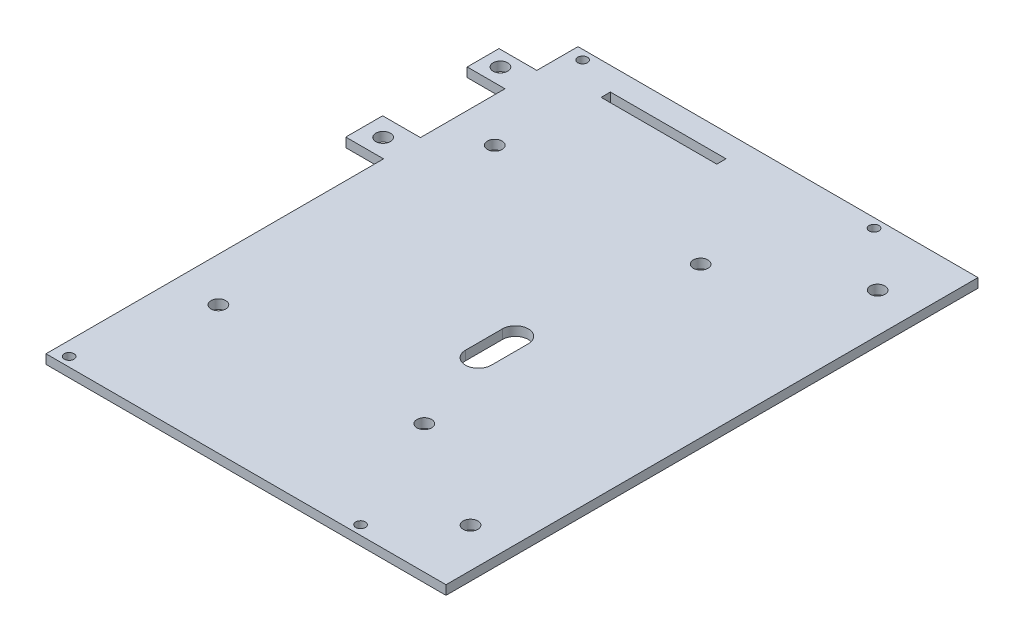
ISO-10303-21;
HEADER;
FILE_DESCRIPTION(('STEP AP214'),'2;1');
FILE_NAME('part.step','',(''),(''),'','','');
FILE_SCHEMA(('AUTOMOTIVE_DESIGN { 1 0 10303 214 1 1 1 1 }'));
ENDSEC;
DATA;
#1=APPLICATION_CONTEXT('core data for automotive mechanical design processes');
#2=APPLICATION_PROTOCOL_DEFINITION('international standard','automotive_design',2000,#1);
#3=PRODUCT_CONTEXT('',#1,'mechanical');
#4=PRODUCT('Part','Part','',(#3));
#5=PRODUCT_RELATED_PRODUCT_CATEGORY('part','',(#4));
#6=PRODUCT_DEFINITION_FORMATION('','',#4);
#7=PRODUCT_DEFINITION_CONTEXT('part definition',#1,'design');
#8=PRODUCT_DEFINITION('design','',#6,#7);
#9=PRODUCT_DEFINITION_SHAPE('','',#8);
#10=(LENGTH_UNIT() NAMED_UNIT(*) SI_UNIT(.MILLI.,.METRE.));
#11=(NAMED_UNIT(*) PLANE_ANGLE_UNIT() SI_UNIT($,.RADIAN.));
#12=(NAMED_UNIT(*) SI_UNIT($,.STERADIAN.) SOLID_ANGLE_UNIT());
#13=UNCERTAINTY_MEASURE_WITH_UNIT(LENGTH_MEASURE(1.E-05),#10,'distance_accuracy_value','');
#14=(GEOMETRIC_REPRESENTATION_CONTEXT(3) GLOBAL_UNCERTAINTY_ASSIGNED_CONTEXT((#13)) GLOBAL_UNIT_ASSIGNED_CONTEXT((#10,
#11,#12)) REPRESENTATION_CONTEXT('',''));
#15=CARTESIAN_POINT('',(0.,0.,0.));
#16=DIRECTION('',(0.,0.,1.));
#17=DIRECTION('',(1.,0.,0.));
#18=AXIS2_PLACEMENT_3D('',#15,#16,#17);
#19=CARTESIAN_POINT('',(0.,2.,5.));
#20=DIRECTION('',(0.,0.,-1.));
#21=DIRECTION('',(-1.,0.,0.));
#22=AXIS2_PLACEMENT_3D('',#19,#20,#21);
#23=PLANE('',#22);
#24=DIRECTION('',(1.,0.,0.));
#25=VECTOR('',#24,1.);
#26=CARTESIAN_POINT('',(0.,0.,5.));
#27=LINE('',#26,#25);
#28=CARTESIAN_POINT('',(12.,0.,5.));
#29=VERTEX_POINT('',#28);
#30=CARTESIAN_POINT('',(37.,0.,5.));
#31=VERTEX_POINT('',#30);
#32=EDGE_CURVE('E321',#29,#31,#27,.T.);
#33=ORIENTED_EDGE('',*,*,#32,.T.);
#34=DIRECTION('',(0.,-1.,0.));
#35=VECTOR('',#34,1.);
#36=CARTESIAN_POINT('',(37.,2.,5.));
#37=LINE('',#36,#35);
#38=CARTESIAN_POINT('',(37.,2.,5.));
#39=VERTEX_POINT('',#38);
#40=EDGE_CURVE('E11',#39,#31,#37,.T.);
#41=ORIENTED_EDGE('',*,*,#40,.F.);
#42=DIRECTION('',(1.,0.,0.));
#43=VECTOR('',#42,1.);
#44=CARTESIAN_POINT('',(0.,2.,5.));
#45=LINE('',#44,#43);
#46=CARTESIAN_POINT('',(12.,2.,5.));
#47=VERTEX_POINT('',#46);
#48=EDGE_CURVE('E194',#47,#39,#45,.T.);
#49=ORIENTED_EDGE('',*,*,#48,.F.);
#50=DIRECTION('',(0.,-1.,0.));
#51=VECTOR('',#50,1.);
#52=CARTESIAN_POINT('',(12.,2.,5.));
#53=LINE('',#52,#51);
#54=EDGE_CURVE('E61',#47,#29,#53,.T.);
#55=ORIENTED_EDGE('',*,*,#54,.T.);
#56=EDGE_LOOP('',(#33,#41,#49,#55));
#57=FACE_BOUND('',#56,.T.);
#58=ADVANCED_FACE('F41',(#57),#23,.F.);
#59=CARTESIAN_POINT('',(37.,2.,0.));
#60=DIRECTION('',(1.,0.,0.));
#61=DIRECTION('',(0.,0.,-1.));
#62=AXIS2_PLACEMENT_3D('',#59,#60,#61);
#63=PLANE('',#62);
#64=DIRECTION('',(0.,0.,1.));
#65=VECTOR('',#64,1.);
#66=CARTESIAN_POINT('',(37.,0.,0.));
#67=LINE('',#66,#65);
#68=CARTESIAN_POINT('',(37.,0.,7.));
#69=VERTEX_POINT('',#68);
#70=EDGE_CURVE('E201',#31,#69,#67,.T.);
#71=ORIENTED_EDGE('',*,*,#70,.T.);
#72=DIRECTION('',(0.,-1.,0.));
#73=VECTOR('',#72,1.);
#74=CARTESIAN_POINT('',(37.,2.,7.));
#75=LINE('',#74,#73);
#76=CARTESIAN_POINT('',(37.,2.,7.));
#77=VERTEX_POINT('',#76);
#78=EDGE_CURVE('E52',#77,#69,#75,.T.);
#79=ORIENTED_EDGE('',*,*,#78,.F.);
#80=DIRECTION('',(0.,0.,1.));
#81=VECTOR('',#80,1.);
#82=CARTESIAN_POINT('',(37.,2.,0.));
#83=LINE('',#82,#81);
#84=EDGE_CURVE('E187',#39,#77,#83,.T.);
#85=ORIENTED_EDGE('',*,*,#84,.F.);
#86=ORIENTED_EDGE('',*,*,#40,.T.);
#87=EDGE_LOOP('',(#71,#79,#85,#86));
#88=FACE_BOUND('',#87,.T.);
#89=ADVANCED_FACE('F200',(#88),#63,.F.);
#90=CARTESIAN_POINT('',(0.,2.,7.));
#91=DIRECTION('',(0.,0.,-1.));
#92=DIRECTION('',(-1.,0.,0.));
#93=AXIS2_PLACEMENT_3D('',#90,#91,#92);
#94=PLANE('',#93);
#95=DIRECTION('',(1.,0.,0.));
#96=VECTOR('',#95,1.);
#97=CARTESIAN_POINT('',(0.,0.,7.));
#98=LINE('',#97,#96);
#99=CARTESIAN_POINT('',(12.,0.,7.));
#100=VERTEX_POINT('',#99);
#101=EDGE_CURVE('E326',#100,#69,#98,.T.);
#102=ORIENTED_EDGE('',*,*,#101,.F.);
#103=DIRECTION('',(0.,-1.,0.));
#104=VECTOR('',#103,1.);
#105=CARTESIAN_POINT('',(12.,2.,7.));
#106=LINE('',#105,#104);
#107=CARTESIAN_POINT('',(12.,2.,7.));
#108=VERTEX_POINT('',#107);
#109=EDGE_CURVE('E123',#108,#100,#106,.T.);
#110=ORIENTED_EDGE('',*,*,#109,.F.);
#111=DIRECTION('',(1.,0.,0.));
#112=VECTOR('',#111,1.);
#113=CARTESIAN_POINT('',(0.,2.,7.));
#114=LINE('',#113,#112);
#115=EDGE_CURVE('E193',#108,#77,#114,.T.);
#116=ORIENTED_EDGE('',*,*,#115,.T.);
#117=ORIENTED_EDGE('',*,*,#78,.T.);
#118=EDGE_LOOP('',(#102,#110,#116,#117));
#119=FACE_BOUND('',#118,.T.);
#120=ADVANCED_FACE('F206',(#119),#94,.T.);
#121=CARTESIAN_POINT('',(86.47,2.,0.));
#122=DIRECTION('',(1.,0.,0.));
#123=DIRECTION('',(0.,0.,-1.));
#124=AXIS2_PLACEMENT_3D('',#121,#122,#123);
#125=PLANE('',#124);
#126=DIRECTION('',(0.,0.,1.));
#127=VECTOR('',#126,1.);
#128=CARTESIAN_POINT('',(86.47,0.,0.));
#129=LINE('',#128,#127);
#130=CARTESIAN_POINT('',(86.47,0.,0.));
#131=VERTEX_POINT('',#130);
#132=CARTESIAN_POINT('',(86.47,0.,115.));
#133=VERTEX_POINT('',#132);
#134=EDGE_CURVE('E279',#131,#133,#129,.T.);
#135=ORIENTED_EDGE('',*,*,#134,.F.);
#136=DIRECTION('',(0.,-1.,0.));
#137=VECTOR('',#136,1.);
#138=CARTESIAN_POINT('',(86.47,2.,0.));
#139=LINE('',#138,#137);
#140=CARTESIAN_POINT('',(86.47,2.,0.));
#141=VERTEX_POINT('',#140);
#142=EDGE_CURVE('E344',#141,#131,#139,.T.);
#143=ORIENTED_EDGE('',*,*,#142,.F.);
#144=DIRECTION('',(0.,0.,1.));
#145=VECTOR('',#144,1.);
#146=CARTESIAN_POINT('',(86.47,2.,0.));
#147=LINE('',#146,#145);
#148=CARTESIAN_POINT('',(86.47,2.,115.));
#149=VERTEX_POINT('',#148);
#150=EDGE_CURVE('E465',#141,#149,#147,.T.);
#151=ORIENTED_EDGE('',*,*,#150,.T.);
#152=DIRECTION('',(0.,-1.,0.));
#153=VECTOR('',#152,1.);
#154=CARTESIAN_POINT('',(86.47,2.,115.));
#155=LINE('',#154,#153);
#156=EDGE_CURVE('E347',#149,#133,#155,.T.);
#157=ORIENTED_EDGE('',*,*,#156,.T.);
#158=EDGE_LOOP('',(#135,#143,#151,#157));
#159=FACE_BOUND('',#158,.T.);
#160=ADVANCED_FACE('F561',(#159),#125,.T.);
#161=CARTESIAN_POINT('',(0.,2.,0.));
#162=DIRECTION('',(0.,0.,-1.));
#163=DIRECTION('',(-1.,0.,0.));
#164=AXIS2_PLACEMENT_3D('',#161,#162,#163);
#165=PLANE('',#164);
#166=DIRECTION('',(1.,0.,0.));
#167=VECTOR('',#166,1.);
#168=CARTESIAN_POINT('',(0.,0.,0.));
#169=LINE('',#168,#167);
#170=CARTESIAN_POINT('',(0.,0.,0.));
#171=VERTEX_POINT('',#170);
#172=EDGE_CURVE('E283',#171,#131,#169,.T.);
#173=ORIENTED_EDGE('',*,*,#172,.F.);
#174=DIRECTION('',(0.,-1.,0.));
#175=VECTOR('',#174,1.);
#176=CARTESIAN_POINT('',(0.,2.,0.));
#177=LINE('',#176,#175);
#178=CARTESIAN_POINT('',(0.,2.,0.));
#179=VERTEX_POINT('',#178);
#180=EDGE_CURVE('E382',#179,#171,#177,.T.);
#181=ORIENTED_EDGE('',*,*,#180,.F.);
#182=DIRECTION('',(1.,0.,0.));
#183=VECTOR('',#182,1.);
#184=CARTESIAN_POINT('',(0.,2.,0.));
#185=LINE('',#184,#183);
#186=EDGE_CURVE('E469',#179,#141,#185,.T.);
#187=ORIENTED_EDGE('',*,*,#186,.T.);
#188=ORIENTED_EDGE('',*,*,#142,.T.);
#189=EDGE_LOOP('',(#173,#181,#187,#188));
#190=FACE_BOUND('',#189,.T.);
#191=ADVANCED_FACE('F538',(#190),#165,.T.);
#192=CARTESIAN_POINT('',(0.,2.,0.));
#193=DIRECTION('',(1.,0.,0.));
#194=DIRECTION('',(0.,0.,-1.));
#195=AXIS2_PLACEMENT_3D('',#192,#193,#194);
#196=PLANE('',#195);
#197=DIRECTION('',(0.,0.,1.));
#198=VECTOR('',#197,1.);
#199=CARTESIAN_POINT('',(0.,0.,0.));
#200=LINE('',#199,#198);
#201=CARTESIAN_POINT('',(0.,0.,8.90000000000004));
#202=VERTEX_POINT('',#201);
#203=EDGE_CURVE('E287',#171,#202,#200,.T.);
#204=ORIENTED_EDGE('',*,*,#203,.T.);
#205=DIRECTION('',(0.,-1.,0.));
#206=VECTOR('',#205,1.);
#207=CARTESIAN_POINT('',(0.,2.,8.90000000000004));
#208=LINE('',#207,#206);
#209=CARTESIAN_POINT('',(0.,2.,8.90000000000004));
#210=VERTEX_POINT('',#209);
#211=EDGE_CURVE('E379',#210,#202,#208,.T.);
#212=ORIENTED_EDGE('',*,*,#211,.F.);
#213=DIRECTION('',(0.,0.,1.));
#214=VECTOR('',#213,1.);
#215=CARTESIAN_POINT('',(0.,2.,0.));
#216=LINE('',#215,#214);
#217=EDGE_CURVE('E473',#179,#210,#216,.T.);
#218=ORIENTED_EDGE('',*,*,#217,.F.);
#219=ORIENTED_EDGE('',*,*,#180,.T.);
#220=EDGE_LOOP('',(#204,#212,#218,#219));
#221=FACE_BOUND('',#220,.T.);
#222=ADVANCED_FACE('F544',(#221),#196,.F.);
#223=CARTESIAN_POINT('',(0.,2.,8.90000000000003));
#224=DIRECTION('',(0.,0.,-1.));
#225=DIRECTION('',(-1.,0.,0.));
#226=AXIS2_PLACEMENT_3D('',#223,#224,#225);
#227=PLANE('',#226);
#228=DIRECTION('',(1.,0.,0.));
#229=VECTOR('',#228,1.);
#230=CARTESIAN_POINT('',(0.,0.,8.90000000000003));
#231=LINE('',#230,#229);
#232=CARTESIAN_POINT('',(-8.17000000000001,0.,8.90000000000005));
#233=VERTEX_POINT('',#232);
#234=EDGE_CURVE('E291',#233,#202,#231,.T.);
#235=ORIENTED_EDGE('',*,*,#234,.F.);
#236=DIRECTION('',(0.,-1.,0.));
#237=VECTOR('',#236,1.);
#238=CARTESIAN_POINT('',(-8.17000000000001,2.,8.90000000000005));
#239=LINE('',#238,#237);
#240=CARTESIAN_POINT('',(-8.17000000000001,2.,8.90000000000005));
#241=VERTEX_POINT('',#240);
#242=EDGE_CURVE('E376',#241,#233,#239,.T.);
#243=ORIENTED_EDGE('',*,*,#242,.F.);
#244=DIRECTION('',(1.,0.,0.));
#245=VECTOR('',#244,1.);
#246=CARTESIAN_POINT('',(0.,2.,8.90000000000003));
#247=LINE('',#246,#245);
#248=EDGE_CURVE('E476',#241,#210,#247,.T.);
#249=ORIENTED_EDGE('',*,*,#248,.T.);
#250=ORIENTED_EDGE('',*,*,#211,.T.);
#251=EDGE_LOOP('',(#235,#243,#249,#250));
#252=FACE_BOUND('',#251,.T.);
#253=ADVANCED_FACE('F550',(#252),#227,.T.);
#254=CARTESIAN_POINT('',(-8.17000000000001,2.,0.));
#255=DIRECTION('',(1.,0.,0.));
#256=DIRECTION('',(0.,0.,-1.));
#257=AXIS2_PLACEMENT_3D('',#254,#255,#256);
#258=PLANE('',#257);
#259=DIRECTION('',(0.,0.,1.));
#260=VECTOR('',#259,1.);
#261=CARTESIAN_POINT('',(-8.17000000000001,0.,0.));
#262=LINE('',#261,#260);
#263=CARTESIAN_POINT('',(-8.17000000000001,0.,15.78));
#264=VERTEX_POINT('',#263);
#265=EDGE_CURVE('E297',#233,#264,#262,.T.);
#266=ORIENTED_EDGE('',*,*,#265,.T.);
#267=DIRECTION('',(0.,-1.,0.));
#268=VECTOR('',#267,1.);
#269=CARTESIAN_POINT('',(-8.17000000000001,2.,15.78));
#270=LINE('',#269,#268);
#271=CARTESIAN_POINT('',(-8.17000000000001,2.,15.78));
#272=VERTEX_POINT('',#271);
#273=EDGE_CURVE('E372',#272,#264,#270,.T.);
#274=ORIENTED_EDGE('',*,*,#273,.F.);
#275=DIRECTION('',(0.,0.,1.));
#276=VECTOR('',#275,1.);
#277=CARTESIAN_POINT('',(-8.17000000000001,2.,0.));
#278=LINE('',#277,#276);
#279=EDGE_CURVE('E482',#241,#272,#278,.T.);
#280=ORIENTED_EDGE('',*,*,#279,.F.);
#281=ORIENTED_EDGE('',*,*,#242,.T.);
#282=EDGE_LOOP('',(#266,#274,#280,#281));
#283=FACE_BOUND('',#282,.T.);
#284=ADVANCED_FACE('F553',(#283),#258,.F.);
#285=CARTESIAN_POINT('',(0.,2.,15.78));
#286=DIRECTION('',(0.,0.,-1.));
#287=DIRECTION('',(-1.,0.,0.));
#288=AXIS2_PLACEMENT_3D('',#285,#286,#287);
#289=PLANE('',#288);
#290=DIRECTION('',(1.,0.,0.));
#291=VECTOR('',#290,1.);
#292=CARTESIAN_POINT('',(0.,0.,15.78));
#293=LINE('',#292,#291);
#294=CARTESIAN_POINT('',(0.,0.,15.78));
#295=VERTEX_POINT('',#294);
#296=EDGE_CURVE('E301',#264,#295,#293,.T.);
#297=ORIENTED_EDGE('',*,*,#296,.T.);
#298=DIRECTION('',(0.,-1.,0.));
#299=VECTOR('',#298,1.);
#300=CARTESIAN_POINT('',(0.,2.,15.78));
#301=LINE('',#300,#299);
#302=CARTESIAN_POINT('',(0.,2.,15.78));
#303=VERTEX_POINT('',#302);
#304=EDGE_CURVE('E368',#303,#295,#301,.T.);
#305=ORIENTED_EDGE('',*,*,#304,.F.);
#306=DIRECTION('',(1.,0.,0.));
#307=VECTOR('',#306,1.);
#308=CARTESIAN_POINT('',(0.,2.,15.78));
#309=LINE('',#308,#307);
#310=EDGE_CURVE('E486',#272,#303,#309,.T.);
#311=ORIENTED_EDGE('',*,*,#310,.F.);
#312=ORIENTED_EDGE('',*,*,#273,.T.);
#313=EDGE_LOOP('',(#297,#305,#311,#312));
#314=FACE_BOUND('',#313,.T.);
#315=ADVANCED_FACE('F555',(#314),#289,.F.);
#316=CARTESIAN_POINT('',(0.,0.,34.06));
#317=VERTEX_POINT('',#316);
#318=EDGE_CURVE('E293',#295,#317,#200,.T.);
#319=ORIENTED_EDGE('',*,*,#318,.T.);
#320=DIRECTION('',(0.,-1.,0.));
#321=VECTOR('',#320,1.);
#322=CARTESIAN_POINT('',(0.,2.,34.06));
#323=LINE('',#322,#321);
#324=CARTESIAN_POINT('',(0.,2.,34.06));
#325=VERTEX_POINT('',#324);
#326=EDGE_CURVE('E365',#325,#317,#323,.T.);
#327=ORIENTED_EDGE('',*,*,#326,.F.);
#328=EDGE_CURVE('E478',#303,#325,#216,.T.);
#329=ORIENTED_EDGE('',*,*,#328,.F.);
#330=ORIENTED_EDGE('',*,*,#304,.T.);
#331=EDGE_LOOP('',(#319,#327,#329,#330));
#332=FACE_BOUND('',#331,.T.);
#333=ADVANCED_FACE('F515',(#332),#196,.F.);
#334=CARTESIAN_POINT('',(0.,2.,34.06));
#335=DIRECTION('',(0.,0.,-1.));
#336=DIRECTION('',(-1.,0.,0.));
#337=AXIS2_PLACEMENT_3D('',#334,#335,#336);
#338=PLANE('',#337);
#339=DIRECTION('',(1.,0.,0.));
#340=VECTOR('',#339,1.);
#341=CARTESIAN_POINT('',(0.,0.,34.06));
#342=LINE('',#341,#340);
#343=CARTESIAN_POINT('',(-8.17000000000001,0.,34.06));
#344=VERTEX_POINT('',#343);
#345=EDGE_CURVE('E305',#344,#317,#342,.T.);
#346=ORIENTED_EDGE('',*,*,#345,.F.);
#347=DIRECTION('',(0.,-1.,0.));
#348=VECTOR('',#347,1.);
#349=CARTESIAN_POINT('',(-8.17000000000001,2.,34.06));
#350=LINE('',#349,#348);
#351=CARTESIAN_POINT('',(-8.17000000000001,2.,34.06));
#352=VERTEX_POINT('',#351);
#353=EDGE_CURVE('E362',#352,#344,#350,.T.);
#354=ORIENTED_EDGE('',*,*,#353,.F.);
#355=DIRECTION('',(1.,0.,0.));
#356=VECTOR('',#355,1.);
#357=CARTESIAN_POINT('',(0.,2.,34.06));
#358=LINE('',#357,#356);
#359=EDGE_CURVE('E490',#352,#325,#358,.T.);
#360=ORIENTED_EDGE('',*,*,#359,.T.);
#361=ORIENTED_EDGE('',*,*,#326,.T.);
#362=EDGE_LOOP('',(#346,#354,#360,#361));
#363=FACE_BOUND('',#362,.T.);
#364=ADVANCED_FACE('F518',(#363),#338,.T.);
#365=CARTESIAN_POINT('',(-8.17000000000001,2.,0.));
#366=DIRECTION('',(1.,0.,0.));
#367=DIRECTION('',(0.,0.,-1.));
#368=AXIS2_PLACEMENT_3D('',#365,#366,#367);
#369=PLANE('',#368);
#370=DIRECTION('',(0.,0.,1.));
#371=VECTOR('',#370,1.);
#372=CARTESIAN_POINT('',(-8.17000000000001,0.,0.));
#373=LINE('',#372,#371);
#374=CARTESIAN_POINT('',(-8.17000000000001,0.,42.03));
#375=VERTEX_POINT('',#374);
#376=EDGE_CURVE('E309',#344,#375,#373,.T.);
#377=ORIENTED_EDGE('',*,*,#376,.T.);
#378=DIRECTION('',(0.,-1.,0.));
#379=VECTOR('',#378,1.);
#380=CARTESIAN_POINT('',(-8.17000000000001,2.,42.03));
#381=LINE('',#380,#379);
#382=CARTESIAN_POINT('',(-8.17000000000001,2.,42.03));
#383=VERTEX_POINT('',#382);
#384=EDGE_CURVE('E358',#383,#375,#381,.T.);
#385=ORIENTED_EDGE('',*,*,#384,.F.);
#386=DIRECTION('',(0.,0.,1.));
#387=VECTOR('',#386,1.);
#388=CARTESIAN_POINT('',(-8.17000000000001,2.,0.));
#389=LINE('',#388,#387);
#390=EDGE_CURVE('E494',#352,#383,#389,.T.);
#391=ORIENTED_EDGE('',*,*,#390,.F.);
#392=ORIENTED_EDGE('',*,*,#353,.T.);
#393=EDGE_LOOP('',(#377,#385,#391,#392));
#394=FACE_BOUND('',#393,.T.);
#395=ADVANCED_FACE('F523',(#394),#369,.F.);
#396=CARTESIAN_POINT('',(0.,2.,42.03));
#397=DIRECTION('',(0.,0.,-1.));
#398=DIRECTION('',(-1.,0.,0.));
#399=AXIS2_PLACEMENT_3D('',#396,#397,#398);
#400=PLANE('',#399);
#401=DIRECTION('',(1.,0.,0.));
#402=VECTOR('',#401,1.);
#403=CARTESIAN_POINT('',(0.,0.,42.03));
#404=LINE('',#403,#402);
#405=CARTESIAN_POINT('',(0.,0.,42.03));
#406=VERTEX_POINT('',#405);
#407=EDGE_CURVE('E313',#375,#406,#404,.T.);
#408=ORIENTED_EDGE('',*,*,#407,.T.);
#409=DIRECTION('',(0.,-1.,0.));
#410=VECTOR('',#409,1.);
#411=CARTESIAN_POINT('',(0.,2.,42.03));
#412=LINE('',#411,#410);
#413=CARTESIAN_POINT('',(0.,2.,42.03));
#414=VERTEX_POINT('',#413);
#415=EDGE_CURVE('E354',#414,#406,#412,.T.);
#416=ORIENTED_EDGE('',*,*,#415,.F.);
#417=DIRECTION('',(1.,0.,0.));
#418=VECTOR('',#417,1.);
#419=CARTESIAN_POINT('',(0.,2.,42.03));
#420=LINE('',#419,#418);
#421=EDGE_CURVE('E498',#383,#414,#420,.T.);
#422=ORIENTED_EDGE('',*,*,#421,.F.);
#423=ORIENTED_EDGE('',*,*,#384,.T.);
#424=EDGE_LOOP('',(#408,#416,#422,#423));
#425=FACE_BOUND('',#424,.T.);
#426=ADVANCED_FACE('F527',(#425),#400,.F.);
#427=CARTESIAN_POINT('',(0.,0.,115.));
#428=VERTEX_POINT('',#427);
#429=EDGE_CURVE('E292',#406,#428,#200,.T.);
#430=ORIENTED_EDGE('',*,*,#429,.T.);
#431=DIRECTION('',(0.,-1.,0.));
#432=VECTOR('',#431,1.);
#433=CARTESIAN_POINT('',(0.,2.,115.));
#434=LINE('',#433,#432);
#435=CARTESIAN_POINT('',(0.,2.,115.));
#436=VERTEX_POINT('',#435);
#437=EDGE_CURVE('E350',#436,#428,#434,.T.);
#438=ORIENTED_EDGE('',*,*,#437,.F.);
#439=EDGE_CURVE('E477',#414,#436,#216,.T.);
#440=ORIENTED_EDGE('',*,*,#439,.F.);
#441=ORIENTED_EDGE('',*,*,#415,.T.);
#442=EDGE_LOOP('',(#430,#438,#440,#441));
#443=FACE_BOUND('',#442,.T.);
#444=ADVANCED_FACE('F530',(#443),#196,.F.);
#445=CARTESIAN_POINT('',(47.47,2.,69.));
#446=DIRECTION('',(0.,-1.,0.));
#447=DIRECTION('',(0.,0.,-1.));
#448=AXIS2_PLACEMENT_3D('',#445,#446,#447);
#449=CYLINDRICAL_SURFACE('',#448,2.8);
#450=CARTESIAN_POINT('',(47.47,0.,69.));
#451=DIRECTION('',(0.,1.,0.));
#452=DIRECTION('',(0.,0.,1.));
#453=AXIS2_PLACEMENT_3D('',#450,#451,#452);
#454=CIRCLE('',#453,2.8);
#455=CARTESIAN_POINT('',(44.67,0.,69.));
#456=VERTEX_POINT('',#455);
#457=CARTESIAN_POINT('',(50.27,0.,69.));
#458=VERTEX_POINT('',#457);
#459=EDGE_CURVE('E223',#456,#458,#454,.T.);
#460=ORIENTED_EDGE('',*,*,#459,.F.);
#461=DIRECTION('',(0.,-1.,0.));
#462=VECTOR('',#461,1.);
#463=CARTESIAN_POINT('',(44.67,2.,69.));
#464=LINE('',#463,#462);
#465=CARTESIAN_POINT('',(44.67,2.,69.));
#466=VERTEX_POINT('',#465);
#467=EDGE_CURVE('E45',#466,#456,#464,.T.);
#468=ORIENTED_EDGE('',*,*,#467,.F.);
#469=CARTESIAN_POINT('',(47.47,2.,69.));
#470=DIRECTION('',(0.,1.,0.));
#471=DIRECTION('',(0.,0.,1.));
#472=AXIS2_PLACEMENT_3D('',#469,#470,#471);
#473=CIRCLE('',#472,2.8);
#474=CARTESIAN_POINT('',(50.27,2.,69.));
#475=VERTEX_POINT('',#474);
#476=EDGE_CURVE('E341',#466,#475,#473,.T.);
#477=ORIENTED_EDGE('',*,*,#476,.T.);
#478=DIRECTION('',(0.,-1.,0.));
#479=VECTOR('',#478,1.);
#480=CARTESIAN_POINT('',(50.27,2.,69.));
#481=LINE('',#480,#479);
#482=EDGE_CURVE('E222',#475,#458,#481,.T.);
#483=ORIENTED_EDGE('',*,*,#482,.T.);
#484=EDGE_LOOP('',(#460,#468,#477,#483));
#485=FACE_BOUND('',#484,.T.);
#486=ADVANCED_FACE('F43',(#485),#449,.F.);
#487=CARTESIAN_POINT('',(44.67,2.,0.));
#488=DIRECTION('',(1.,0.,0.));
#489=DIRECTION('',(0.,0.,-1.));
#490=AXIS2_PLACEMENT_3D('',#487,#488,#489);
#491=PLANE('',#490);
#492=DIRECTION('',(0.,0.,1.));
#493=VECTOR('',#492,1.);
#494=CARTESIAN_POINT('',(44.67,0.,0.));
#495=LINE('',#494,#493);
#496=CARTESIAN_POINT('',(44.67,0.,61.));
#497=VERTEX_POINT('',#496);
#498=EDGE_CURVE('E227',#497,#456,#495,.T.);
#499=ORIENTED_EDGE('',*,*,#498,.F.);
#500=DIRECTION('',(0.,-1.,0.));
#501=VECTOR('',#500,1.);
#502=CARTESIAN_POINT('',(44.67,2.,61.));
#503=LINE('',#502,#501);
#504=CARTESIAN_POINT('',(44.67,2.,61.));
#505=VERTEX_POINT('',#504);
#506=EDGE_CURVE('E391',#505,#497,#503,.T.);
#507=ORIENTED_EDGE('',*,*,#506,.F.);
#508=DIRECTION('',(0.,0.,1.));
#509=VECTOR('',#508,1.);
#510=CARTESIAN_POINT('',(44.67,2.,0.));
#511=LINE('',#510,#509);
#512=EDGE_CURVE('E402',#505,#466,#511,.T.);
#513=ORIENTED_EDGE('',*,*,#512,.T.);
#514=ORIENTED_EDGE('',*,*,#467,.T.);
#515=EDGE_LOOP('',(#499,#507,#513,#514));
#516=FACE_BOUND('',#515,.T.);
#517=ADVANCED_FACE('F400',(#516),#491,.T.);
#518=CARTESIAN_POINT('',(47.47,2.,61.));
#519=DIRECTION('',(0.,-1.,0.));
#520=DIRECTION('',(0.,0.,-1.));
#521=AXIS2_PLACEMENT_3D('',#518,#519,#520);
#522=CYLINDRICAL_SURFACE('',#521,2.8);
#523=CARTESIAN_POINT('',(47.47,0.,61.));
#524=DIRECTION('',(0.,1.,0.));
#525=DIRECTION('',(0.,0.,1.));
#526=AXIS2_PLACEMENT_3D('',#523,#524,#525);
#527=CIRCLE('',#526,2.8);
#528=CARTESIAN_POINT('',(50.27,0.,61.));
#529=VERTEX_POINT('',#528);
#530=EDGE_CURVE('E231',#529,#497,#527,.T.);
#531=ORIENTED_EDGE('',*,*,#530,.F.);
#532=DIRECTION('',(0.,-1.,0.));
#533=VECTOR('',#532,1.);
#534=CARTESIAN_POINT('',(50.27,2.,61.));
#535=LINE('',#534,#533);
#536=CARTESIAN_POINT('',(50.27,2.,61.));
#537=VERTEX_POINT('',#536);
#538=EDGE_CURVE('E389',#537,#529,#535,.T.);
#539=ORIENTED_EDGE('',*,*,#538,.F.);
#540=CARTESIAN_POINT('',(47.47,2.,61.));
#541=DIRECTION('',(0.,1.,0.));
#542=DIRECTION('',(0.,0.,1.));
#543=AXIS2_PLACEMENT_3D('',#540,#541,#542);
#544=CIRCLE('',#543,2.8);
#545=EDGE_CURVE('E411',#537,#505,#544,.T.);
#546=ORIENTED_EDGE('',*,*,#545,.T.);
#547=ORIENTED_EDGE('',*,*,#506,.T.);
#548=EDGE_LOOP('',(#531,#539,#546,#547));
#549=FACE_BOUND('',#548,.T.);
#550=ADVANCED_FACE('F408',(#549),#522,.F.);
#551=CARTESIAN_POINT('',(-4.07000000000002,2.,38.06));
#552=DIRECTION('',(0.,-1.,0.));
#553=DIRECTION('',(0.,0.,-1.));
#554=AXIS2_PLACEMENT_3D('',#551,#552,#553);
#555=CYLINDRICAL_SURFACE('',#554,1.58499999999999);
#556=CARTESIAN_POINT('',(-4.07000000000002,2.,38.06));
#557=DIRECTION('',(0.,1.,0.));
#558=DIRECTION('',(0.,0.,1.));
#559=AXIS2_PLACEMENT_3D('',#556,#557,#558);
#560=CIRCLE('',#559,1.58499999999999);
#561=CARTESIAN_POINT('',(-4.07000000000002,2.,39.645));
#562=VERTEX_POINT('',#561);
#563=EDGE_CURVE('E211',#562,#562,#560,.T.);
#564=ORIENTED_EDGE('',*,*,#563,.T.);
#565=EDGE_LOOP('',(#564));
#566=FACE_BOUND('',#565,.T.);
#567=CARTESIAN_POINT('',(-4.07000000000002,0.,38.06));
#568=DIRECTION('',(0.,1.,0.));
#569=DIRECTION('',(0.,0.,1.));
#570=AXIS2_PLACEMENT_3D('',#567,#568,#569);
#571=CIRCLE('',#570,1.58499999999999);
#572=CARTESIAN_POINT('',(-4.07000000000002,0.,39.645));
#573=VERTEX_POINT('',#572);
#574=EDGE_CURVE('E333',#573,#573,#571,.T.);
#575=ORIENTED_EDGE('',*,*,#574,.F.);
#576=EDGE_LOOP('',(#575));
#577=FACE_BOUND('',#576,.T.);
#578=ADVANCED_FACE('F637',(#566,#577),#555,.F.);
#579=CARTESIAN_POINT('',(12.,2.,0.));
#580=DIRECTION('',(1.,0.,0.));
#581=DIRECTION('',(0.,0.,-1.));
#582=AXIS2_PLACEMENT_3D('',#579,#580,#581);
#583=PLANE('',#582);
#584=DIRECTION('',(0.,0.,1.));
#585=VECTOR('',#584,1.);
#586=CARTESIAN_POINT('',(12.,0.,0.));
#587=LINE('',#586,#585);
#588=EDGE_CURVE('E329',#29,#100,#587,.T.);
#589=ORIENTED_EDGE('',*,*,#588,.F.);
#590=ORIENTED_EDGE('',*,*,#54,.F.);
#591=DIRECTION('',(0.,0.,1.));
#592=VECTOR('',#591,1.);
#593=CARTESIAN_POINT('',(12.,2.,0.));
#594=LINE('',#593,#592);
#595=EDGE_CURVE('E208',#47,#108,#594,.T.);
#596=ORIENTED_EDGE('',*,*,#595,.T.);
#597=ORIENTED_EDGE('',*,*,#109,.T.);
#598=EDGE_LOOP('',(#589,#590,#596,#597));
#599=FACE_BOUND('',#598,.T.);
#600=ADVANCED_FACE('F581',(#599),#583,.T.);
#601=CARTESIAN_POINT('',(0.,2.,115.));
#602=DIRECTION('',(0.,0.,-1.));
#603=DIRECTION('',(-1.,0.,0.));
#604=AXIS2_PLACEMENT_3D('',#601,#602,#603);
#605=PLANE('',#604);
#606=DIRECTION('',(1.,0.,0.));
#607=VECTOR('',#606,1.);
#608=CARTESIAN_POINT('',(0.,0.,115.));
#609=LINE('',#608,#607);
#610=EDGE_CURVE('E317',#428,#133,#609,.T.);
#611=ORIENTED_EDGE('',*,*,#610,.T.);
#612=ORIENTED_EDGE('',*,*,#156,.F.);
#613=DIRECTION('',(1.,0.,0.));
#614=VECTOR('',#613,1.);
#615=CARTESIAN_POINT('',(0.,2.,115.));
#616=LINE('',#615,#614);
#617=EDGE_CURVE('E502',#436,#149,#616,.T.);
#618=ORIENTED_EDGE('',*,*,#617,.F.);
#619=ORIENTED_EDGE('',*,*,#437,.T.);
#620=EDGE_LOOP('',(#611,#612,#618,#619));
#621=FACE_BOUND('',#620,.T.);
#622=ADVANCED_FACE('F532',(#621),#605,.F.);
#623=CARTESIAN_POINT('',(9.47000000000001,2.,27.46));
#624=DIRECTION('',(0.,-1.,0.));
#625=DIRECTION('',(0.,0.,-1.));
#626=AXIS2_PLACEMENT_3D('',#623,#624,#625);
#627=CYLINDRICAL_SURFACE('',#626,1.58499999999999);
#628=CARTESIAN_POINT('',(9.47000000000001,2.,27.46));
#629=DIRECTION('',(0.,1.,0.));
#630=DIRECTION('',(0.,0.,1.));
#631=AXIS2_PLACEMENT_3D('',#628,#629,#630);
#632=CIRCLE('',#631,1.58499999999999);
#633=CARTESIAN_POINT('',(9.47000000000001,2.,29.045));
#634=VERTEX_POINT('',#633);
#635=EDGE_CURVE('E461',#634,#634,#632,.T.);
#636=ORIENTED_EDGE('',*,*,#635,.T.);
#637=EDGE_LOOP('',(#636));
#638=FACE_BOUND('',#637,.T.);
#639=CARTESIAN_POINT('',(9.47000000000001,0.,27.46));
#640=DIRECTION('',(0.,1.,0.));
#641=DIRECTION('',(0.,0.,1.));
#642=AXIS2_PLACEMENT_3D('',#639,#640,#641);
#643=CIRCLE('',#642,1.58499999999999);
#644=CARTESIAN_POINT('',(9.47000000000001,0.,29.045));
#645=VERTEX_POINT('',#644);
#646=EDGE_CURVE('E275',#645,#645,#643,.T.);
#647=ORIENTED_EDGE('',*,*,#646,.F.);
#648=EDGE_LOOP('',(#647));
#649=FACE_BOUND('',#648,.T.);
#650=ADVANCED_FACE('F580',(#638,#649),#627,.F.);
#651=CARTESIAN_POINT('',(53.97,2.,27.46));
#652=DIRECTION('',(0.,-1.,0.));
#653=DIRECTION('',(0.,0.,-1.));
#654=AXIS2_PLACEMENT_3D('',#651,#652,#653);
#655=CYLINDRICAL_SURFACE('',#654,1.58499999999999);
#656=CARTESIAN_POINT('',(53.97,2.,27.46));
#657=DIRECTION('',(0.,1.,0.));
#658=DIRECTION('',(0.,0.,1.));
#659=AXIS2_PLACEMENT_3D('',#656,#657,#658);
#660=CIRCLE('',#659,1.58499999999999);
#661=CARTESIAN_POINT('',(53.97,2.,29.045));
#662=VERTEX_POINT('',#661);
#663=EDGE_CURVE('E457',#662,#662,#660,.T.);
#664=ORIENTED_EDGE('',*,*,#663,.T.);
#665=EDGE_LOOP('',(#664));
#666=FACE_BOUND('',#665,.T.);
#667=CARTESIAN_POINT('',(53.97,0.,27.46));
#668=DIRECTION('',(0.,1.,0.));
#669=DIRECTION('',(0.,0.,1.));
#670=AXIS2_PLACEMENT_3D('',#667,#668,#669);
#671=CIRCLE('',#670,1.58499999999999);
#672=CARTESIAN_POINT('',(53.97,0.,29.045));
#673=VERTEX_POINT('',#672);
#674=EDGE_CURVE('E271',#673,#673,#671,.T.);
#675=ORIENTED_EDGE('',*,*,#674,.F.);
#676=EDGE_LOOP('',(#675));
#677=FACE_BOUND('',#676,.T.);
#678=ADVANCED_FACE('F661',(#666,#677),#655,.F.);
#679=CARTESIAN_POINT('',(9.47000000000001,2.,87.2));
#680=DIRECTION('',(0.,-1.,0.));
#681=DIRECTION('',(0.,0.,-1.));
#682=AXIS2_PLACEMENT_3D('',#679,#680,#681);
#683=CYLINDRICAL_SURFACE('',#682,1.58499999999999);
#684=CARTESIAN_POINT('',(9.47000000000001,2.,87.2));
#685=DIRECTION('',(0.,1.,0.));
#686=DIRECTION('',(0.,0.,1.));
#687=AXIS2_PLACEMENT_3D('',#684,#685,#686);
#688=CIRCLE('',#687,1.58499999999999);
#689=CARTESIAN_POINT('',(9.47000000000001,2.,88.785));
#690=VERTEX_POINT('',#689);
#691=EDGE_CURVE('E453',#690,#690,#688,.T.);
#692=ORIENTED_EDGE('',*,*,#691,.T.);
#693=EDGE_LOOP('',(#692));
#694=FACE_BOUND('',#693,.T.);
#695=CARTESIAN_POINT('',(9.47000000000001,0.,87.2));
#696=DIRECTION('',(0.,1.,0.));
#697=DIRECTION('',(0.,0.,1.));
#698=AXIS2_PLACEMENT_3D('',#695,#696,#697);
#699=CIRCLE('',#698,1.58499999999999);
#700=CARTESIAN_POINT('',(9.47000000000001,0.,88.785));
#701=VERTEX_POINT('',#700);
#702=EDGE_CURVE('E267',#701,#701,#699,.T.);
#703=ORIENTED_EDGE('',*,*,#702,.F.);
#704=EDGE_LOOP('',(#703));
#705=FACE_BOUND('',#704,.T.);
#706=ADVANCED_FACE('F668',(#694,#705),#683,.F.);
#707=CARTESIAN_POINT('',(53.97,2.,87.2));
#708=DIRECTION('',(0.,-1.,0.));
#709=DIRECTION('',(0.,0.,-1.));
#710=AXIS2_PLACEMENT_3D('',#707,#708,#709);
#711=CYLINDRICAL_SURFACE('',#710,1.58499999999999);
#712=CARTESIAN_POINT('',(53.97,2.,87.2));
#713=DIRECTION('',(0.,1.,0.));
#714=DIRECTION('',(0.,0.,1.));
#715=AXIS2_PLACEMENT_3D('',#712,#713,#714);
#716=CIRCLE('',#715,1.58499999999999);
#717=CARTESIAN_POINT('',(53.97,2.,88.785));
#718=VERTEX_POINT('',#717);
#719=EDGE_CURVE('E449',#718,#718,#716,.T.);
#720=ORIENTED_EDGE('',*,*,#719,.T.);
#721=EDGE_LOOP('',(#720));
#722=FACE_BOUND('',#721,.T.);
#723=CARTESIAN_POINT('',(53.97,0.,87.2));
#724=DIRECTION('',(0.,1.,0.));
#725=DIRECTION('',(0.,0.,1.));
#726=AXIS2_PLACEMENT_3D('',#723,#724,#725);
#727=CIRCLE('',#726,1.58499999999999);
#728=CARTESIAN_POINT('',(53.97,0.,88.785));
#729=VERTEX_POINT('',#728);
#730=EDGE_CURVE('E263',#729,#729,#727,.T.);
#731=ORIENTED_EDGE('',*,*,#730,.F.);
#732=EDGE_LOOP('',(#731));
#733=FACE_BOUND('',#732,.T.);
#734=ADVANCED_FACE('F676',(#722,#733),#711,.F.);
#735=CARTESIAN_POINT('',(77.97,2.,13.2));
#736=DIRECTION('',(0.,-1.,0.));
#737=DIRECTION('',(0.,0.,-1.));
#738=AXIS2_PLACEMENT_3D('',#735,#736,#737);
#739=CYLINDRICAL_SURFACE('',#738,1.58499999999999);
#740=CARTESIAN_POINT('',(77.97,2.,13.2));
#741=DIRECTION('',(0.,1.,0.));
#742=DIRECTION('',(0.,0.,1.));
#743=AXIS2_PLACEMENT_3D('',#740,#741,#742);
#744=CIRCLE('',#743,1.58499999999999);
#745=CARTESIAN_POINT('',(77.97,2.,14.785));
#746=VERTEX_POINT('',#745);
#747=EDGE_CURVE('E445',#746,#746,#744,.T.);
#748=ORIENTED_EDGE('',*,*,#747,.T.);
#749=EDGE_LOOP('',(#748));
#750=FACE_BOUND('',#749,.T.);
#751=CARTESIAN_POINT('',(77.97,0.,13.2));
#752=DIRECTION('',(0.,1.,0.));
#753=DIRECTION('',(0.,0.,1.));
#754=AXIS2_PLACEMENT_3D('',#751,#752,#753);
#755=CIRCLE('',#754,1.58499999999999);
#756=CARTESIAN_POINT('',(77.97,0.,14.785));
#757=VERTEX_POINT('',#756);
#758=EDGE_CURVE('E259',#757,#757,#755,.T.);
#759=ORIENTED_EDGE('',*,*,#758,.F.);
#760=EDGE_LOOP('',(#759));
#761=FACE_BOUND('',#760,.T.);
#762=ADVANCED_FACE('F684',(#750,#761),#739,.F.);
#763=CARTESIAN_POINT('',(77.97,2.,101.2));
#764=DIRECTION('',(0.,-1.,0.));
#765=DIRECTION('',(0.,0.,-1.));
#766=AXIS2_PLACEMENT_3D('',#763,#764,#765);
#767=CYLINDRICAL_SURFACE('',#766,1.58499999999999);
#768=CARTESIAN_POINT('',(77.97,2.,101.2));
#769=DIRECTION('',(0.,1.,0.));
#770=DIRECTION('',(0.,0.,1.));
#771=AXIS2_PLACEMENT_3D('',#768,#769,#770);
#772=CIRCLE('',#771,1.58499999999999);
#773=CARTESIAN_POINT('',(77.97,2.,102.785));
#774=VERTEX_POINT('',#773);
#775=EDGE_CURVE('E441',#774,#774,#772,.T.);
#776=ORIENTED_EDGE('',*,*,#775,.T.);
#777=EDGE_LOOP('',(#776));
#778=FACE_BOUND('',#777,.T.);
#779=CARTESIAN_POINT('',(77.97,0.,101.2));
#780=DIRECTION('',(0.,1.,0.));
#781=DIRECTION('',(0.,0.,1.));
#782=AXIS2_PLACEMENT_3D('',#779,#780,#781);
#783=CIRCLE('',#782,1.58499999999999);
#784=CARTESIAN_POINT('',(77.97,0.,102.785));
#785=VERTEX_POINT('',#784);
#786=EDGE_CURVE('E255',#785,#785,#783,.T.);
#787=ORIENTED_EDGE('',*,*,#786,.F.);
#788=EDGE_LOOP('',(#787));
#789=FACE_BOUND('',#788,.T.);
#790=ADVANCED_FACE('F692',(#778,#789),#767,.F.);
#791=CARTESIAN_POINT('',(3.,2.,2.));
#792=DIRECTION('',(0.,-1.,0.));
#793=DIRECTION('',(0.,0.,-1.));
#794=AXIS2_PLACEMENT_3D('',#791,#792,#793);
#795=CYLINDRICAL_SURFACE('',#794,1.04999999999999);
#796=CARTESIAN_POINT('',(3.,2.,2.));
#797=DIRECTION('',(0.,1.,0.));
#798=DIRECTION('',(0.,0.,1.));
#799=AXIS2_PLACEMENT_3D('',#796,#797,#798);
#800=CIRCLE('',#799,1.04999999999999);
#801=CARTESIAN_POINT('',(3.,2.,3.04999999999999));
#802=VERTEX_POINT('',#801);
#803=EDGE_CURVE('E437',#802,#802,#800,.T.);
#804=ORIENTED_EDGE('',*,*,#803,.T.);
#805=EDGE_LOOP('',(#804));
#806=FACE_BOUND('',#805,.T.);
#807=CARTESIAN_POINT('',(3.,0.,2.));
#808=DIRECTION('',(0.,1.,0.));
#809=DIRECTION('',(0.,0.,1.));
#810=AXIS2_PLACEMENT_3D('',#807,#808,#809);
#811=CIRCLE('',#810,1.04999999999999);
#812=CARTESIAN_POINT('',(3.,0.,3.04999999999999));
#813=VERTEX_POINT('',#812);
#814=EDGE_CURVE('E251',#813,#813,#811,.T.);
#815=ORIENTED_EDGE('',*,*,#814,.F.);
#816=EDGE_LOOP('',(#815));
#817=FACE_BOUND('',#816,.T.);
#818=ADVANCED_FACE('F700',(#806,#817),#795,.F.);
#819=CARTESIAN_POINT('',(66.,2.,2.));
#820=DIRECTION('',(0.,-1.,0.));
#821=DIRECTION('',(0.,0.,-1.));
#822=AXIS2_PLACEMENT_3D('',#819,#820,#821);
#823=CYLINDRICAL_SURFACE('',#822,1.04999999999999);
#824=CARTESIAN_POINT('',(66.,2.,2.));
#825=DIRECTION('',(0.,1.,0.));
#826=DIRECTION('',(0.,0.,1.));
#827=AXIS2_PLACEMENT_3D('',#824,#825,#826);
#828=CIRCLE('',#827,1.04999999999999);
#829=CARTESIAN_POINT('',(66.,2.,3.04999999999999));
#830=VERTEX_POINT('',#829);
#831=EDGE_CURVE('E433',#830,#830,#828,.T.);
#832=ORIENTED_EDGE('',*,*,#831,.T.);
#833=EDGE_LOOP('',(#832));
#834=FACE_BOUND('',#833,.T.);
#835=CARTESIAN_POINT('',(66.,0.,2.));
#836=DIRECTION('',(0.,1.,0.));
#837=DIRECTION('',(0.,0.,1.));
#838=AXIS2_PLACEMENT_3D('',#835,#836,#837);
#839=CIRCLE('',#838,1.04999999999999);
#840=CARTESIAN_POINT('',(66.,0.,3.04999999999999));
#841=VERTEX_POINT('',#840);
#842=EDGE_CURVE('E247',#841,#841,#839,.T.);
#843=ORIENTED_EDGE('',*,*,#842,.F.);
#844=EDGE_LOOP('',(#843));
#845=FACE_BOUND('',#844,.T.);
#846=ADVANCED_FACE('F708',(#834,#845),#823,.F.);
#847=CARTESIAN_POINT('',(3.00000000000001,2.,113.));
#848=DIRECTION('',(0.,-1.,0.));
#849=DIRECTION('',(0.,0.,-1.));
#850=AXIS2_PLACEMENT_3D('',#847,#848,#849);
#851=CYLINDRICAL_SURFACE('',#850,1.04999999999999);
#852=CARTESIAN_POINT('',(3.00000000000001,2.,113.));
#853=DIRECTION('',(0.,1.,0.));
#854=DIRECTION('',(0.,0.,1.));
#855=AXIS2_PLACEMENT_3D('',#852,#853,#854);
#856=CIRCLE('',#855,1.04999999999999);
#857=CARTESIAN_POINT('',(3.00000000000001,2.,114.05));
#858=VERTEX_POINT('',#857);
#859=EDGE_CURVE('E429',#858,#858,#856,.T.);
#860=ORIENTED_EDGE('',*,*,#859,.T.);
#861=EDGE_LOOP('',(#860));
#862=FACE_BOUND('',#861,.T.);
#863=CARTESIAN_POINT('',(3.00000000000001,0.,113.));
#864=DIRECTION('',(0.,1.,0.));
#865=DIRECTION('',(0.,0.,1.));
#866=AXIS2_PLACEMENT_3D('',#863,#864,#865);
#867=CIRCLE('',#866,1.04999999999999);
#868=CARTESIAN_POINT('',(3.00000000000001,0.,114.05));
#869=VERTEX_POINT('',#868);
#870=EDGE_CURVE('E243',#869,#869,#867,.T.);
#871=ORIENTED_EDGE('',*,*,#870,.F.);
#872=EDGE_LOOP('',(#871));
#873=FACE_BOUND('',#872,.T.);
#874=ADVANCED_FACE('F716',(#862,#873),#851,.F.);
#875=CARTESIAN_POINT('',(66.,2.,113.));
#876=DIRECTION('',(0.,-1.,0.));
#877=DIRECTION('',(0.,0.,-1.));
#878=AXIS2_PLACEMENT_3D('',#875,#876,#877);
#879=CYLINDRICAL_SURFACE('',#878,1.04999999999999);
#880=CARTESIAN_POINT('',(66.,2.,113.));
#881=DIRECTION('',(0.,1.,0.));
#882=DIRECTION('',(0.,0.,1.));
#883=AXIS2_PLACEMENT_3D('',#880,#881,#882);
#884=CIRCLE('',#883,1.04999999999999);
#885=CARTESIAN_POINT('',(66.,2.,114.05));
#886=VERTEX_POINT('',#885);
#887=EDGE_CURVE('E417',#886,#886,#884,.T.);
#888=ORIENTED_EDGE('',*,*,#887,.T.);
#889=EDGE_LOOP('',(#888));
#890=FACE_BOUND('',#889,.T.);
#891=CARTESIAN_POINT('',(66.,0.,113.));
#892=DIRECTION('',(0.,1.,0.));
#893=DIRECTION('',(0.,0.,1.));
#894=AXIS2_PLACEMENT_3D('',#891,#892,#893);
#895=CIRCLE('',#894,1.04999999999999);
#896=CARTESIAN_POINT('',(66.,0.,114.05));
#897=VERTEX_POINT('',#896);
#898=EDGE_CURVE('E239',#897,#897,#895,.T.);
#899=ORIENTED_EDGE('',*,*,#898,.F.);
#900=EDGE_LOOP('',(#899));
#901=FACE_BOUND('',#900,.T.);
#902=ADVANCED_FACE('F724',(#890,#901),#879,.F.);
#903=CARTESIAN_POINT('',(50.27,2.,0.));
#904=DIRECTION('',(1.,0.,0.));
#905=DIRECTION('',(0.,0.,-1.));
#906=AXIS2_PLACEMENT_3D('',#903,#904,#905);
#907=PLANE('',#906);
#908=DIRECTION('',(0.,0.,1.));
#909=VECTOR('',#908,1.);
#910=CARTESIAN_POINT('',(50.27,0.,0.));
#911=LINE('',#910,#909);
#912=EDGE_CURVE('E235',#529,#458,#911,.T.);
#913=ORIENTED_EDGE('',*,*,#912,.T.);
#914=ORIENTED_EDGE('',*,*,#482,.F.);
#915=DIRECTION('',(0.,0.,1.));
#916=VECTOR('',#915,1.);
#917=CARTESIAN_POINT('',(50.27,2.,0.));
#918=LINE('',#917,#916);
#919=EDGE_CURVE('E413',#537,#475,#918,.T.);
#920=ORIENTED_EDGE('',*,*,#919,.F.);
#921=ORIENTED_EDGE('',*,*,#538,.T.);
#922=EDGE_LOOP('',(#913,#914,#920,#921));
#923=FACE_BOUND('',#922,.T.);
#924=ADVANCED_FACE('F414',(#923),#907,.F.);
#925=CARTESIAN_POINT('',(-4.57000000000002,2.,12.2));
#926=DIRECTION('',(0.,-1.,0.));
#927=DIRECTION('',(0.,0.,-1.));
#928=AXIS2_PLACEMENT_3D('',#925,#926,#927);
#929=CYLINDRICAL_SURFACE('',#928,1.58499999999999);
#930=CARTESIAN_POINT('',(-4.57000000000002,2.,12.2));
#931=DIRECTION('',(0.,1.,0.));
#932=DIRECTION('',(0.,0.,1.));
#933=AXIS2_PLACEMENT_3D('',#930,#931,#932);
#934=CIRCLE('',#933,1.58499999999999);
#935=CARTESIAN_POINT('',(-4.57000000000002,2.,13.785));
#936=VERTEX_POINT('',#935);
#937=EDGE_CURVE('E218',#936,#936,#934,.T.);
#938=ORIENTED_EDGE('',*,*,#937,.T.);
#939=EDGE_LOOP('',(#938));
#940=FACE_BOUND('',#939,.T.);
#941=CARTESIAN_POINT('',(-4.57000000000002,0.,12.2));
#942=DIRECTION('',(0.,1.,0.));
#943=DIRECTION('',(0.,0.,1.));
#944=AXIS2_PLACEMENT_3D('',#941,#942,#943);
#945=CIRCLE('',#944,1.58499999999999);
#946=CARTESIAN_POINT('',(-4.57000000000002,0.,13.785));
#947=VERTEX_POINT('',#946);
#948=EDGE_CURVE('E337',#947,#947,#945,.T.);
#949=ORIENTED_EDGE('',*,*,#948,.F.);
#950=EDGE_LOOP('',(#949));
#951=FACE_BOUND('',#950,.T.);
#952=ADVANCED_FACE('F739',(#940,#951),#929,.F.);
#953=CARTESIAN_POINT('',(0.,2.,0.));
#954=DIRECTION('',(0.,1.,0.));
#955=DIRECTION('',(0.,0.,1.));
#956=AXIS2_PLACEMENT_3D('',#953,#954,#955);
#957=PLANE('',#956);
#958=ORIENTED_EDGE('',*,*,#476,.F.);
#959=ORIENTED_EDGE('',*,*,#512,.F.);
#960=ORIENTED_EDGE('',*,*,#545,.F.);
#961=ORIENTED_EDGE('',*,*,#919,.T.);
#962=EDGE_LOOP('',(#958,#959,#960,#961));
#963=FACE_BOUND('',#962,.T.);
#964=ORIENTED_EDGE('',*,*,#887,.F.);
#965=EDGE_LOOP('',(#964));
#966=FACE_BOUND('',#965,.T.);
#967=ORIENTED_EDGE('',*,*,#859,.F.);
#968=EDGE_LOOP('',(#967));
#969=FACE_BOUND('',#968,.T.);
#970=ORIENTED_EDGE('',*,*,#831,.F.);
#971=EDGE_LOOP('',(#970));
#972=FACE_BOUND('',#971,.T.);
#973=ORIENTED_EDGE('',*,*,#803,.F.);
#974=EDGE_LOOP('',(#973));
#975=FACE_BOUND('',#974,.T.);
#976=ORIENTED_EDGE('',*,*,#775,.F.);
#977=EDGE_LOOP('',(#976));
#978=FACE_BOUND('',#977,.T.);
#979=ORIENTED_EDGE('',*,*,#747,.F.);
#980=EDGE_LOOP('',(#979));
#981=FACE_BOUND('',#980,.T.);
#982=ORIENTED_EDGE('',*,*,#719,.F.);
#983=EDGE_LOOP('',(#982));
#984=FACE_BOUND('',#983,.T.);
#985=ORIENTED_EDGE('',*,*,#691,.F.);
#986=EDGE_LOOP('',(#985));
#987=FACE_BOUND('',#986,.T.);
#988=ORIENTED_EDGE('',*,*,#663,.F.);
#989=EDGE_LOOP('',(#988));
#990=FACE_BOUND('',#989,.T.);
#991=ORIENTED_EDGE('',*,*,#635,.F.);
#992=EDGE_LOOP('',(#991));
#993=FACE_BOUND('',#992,.T.);
#994=ORIENTED_EDGE('',*,*,#150,.F.);
#995=ORIENTED_EDGE('',*,*,#186,.F.);
#996=ORIENTED_EDGE('',*,*,#217,.T.);
#997=ORIENTED_EDGE('',*,*,#248,.F.);
#998=ORIENTED_EDGE('',*,*,#279,.T.);
#999=ORIENTED_EDGE('',*,*,#310,.T.);
#1000=ORIENTED_EDGE('',*,*,#328,.T.);
#1001=ORIENTED_EDGE('',*,*,#359,.F.);
#1002=ORIENTED_EDGE('',*,*,#390,.T.);
#1003=ORIENTED_EDGE('',*,*,#421,.T.);
#1004=ORIENTED_EDGE('',*,*,#439,.T.);
#1005=ORIENTED_EDGE('',*,*,#617,.T.);
#1006=EDGE_LOOP('',(#994,#995,#996,#997,#998,#999,#1000,#1001,#1002,#1003,#1004,#1005));
#1007=FACE_BOUND('',#1006,.T.);
#1008=ORIENTED_EDGE('',*,*,#48,.T.);
#1009=ORIENTED_EDGE('',*,*,#84,.T.);
#1010=ORIENTED_EDGE('',*,*,#115,.F.);
#1011=ORIENTED_EDGE('',*,*,#595,.F.);
#1012=EDGE_LOOP('',(#1008,#1009,#1010,#1011));
#1013=FACE_BOUND('',#1012,.T.);
#1014=ORIENTED_EDGE('',*,*,#563,.F.);
#1015=EDGE_LOOP('',(#1014));
#1016=FACE_BOUND('',#1015,.T.);
#1017=ORIENTED_EDGE('',*,*,#937,.F.);
#1018=EDGE_LOOP('',(#1017));
#1019=FACE_BOUND('',#1018,.T.);
#1020=ADVANCED_FACE('F189',(#963,#966,#969,#972,#975,#978,#981,#984,#987,#990,#993,#1007,#1013,
#1016,#1019),#957,.T.);
#1021=CARTESIAN_POINT('',(0.,0.,0.));
#1022=DIRECTION('',(0.,1.,0.));
#1023=DIRECTION('',(0.,0.,1.));
#1024=AXIS2_PLACEMENT_3D('',#1021,#1022,#1023);
#1025=PLANE('',#1024);
#1026=ORIENTED_EDGE('',*,*,#459,.T.);
#1027=ORIENTED_EDGE('',*,*,#912,.F.);
#1028=ORIENTED_EDGE('',*,*,#530,.T.);
#1029=ORIENTED_EDGE('',*,*,#498,.T.);
#1030=EDGE_LOOP('',(#1026,#1027,#1028,#1029));
#1031=FACE_BOUND('',#1030,.T.);
#1032=ORIENTED_EDGE('',*,*,#898,.T.);
#1033=EDGE_LOOP('',(#1032));
#1034=FACE_BOUND('',#1033,.T.);
#1035=ORIENTED_EDGE('',*,*,#870,.T.);
#1036=EDGE_LOOP('',(#1035));
#1037=FACE_BOUND('',#1036,.T.);
#1038=ORIENTED_EDGE('',*,*,#842,.T.);
#1039=EDGE_LOOP('',(#1038));
#1040=FACE_BOUND('',#1039,.T.);
#1041=ORIENTED_EDGE('',*,*,#814,.T.);
#1042=EDGE_LOOP('',(#1041));
#1043=FACE_BOUND('',#1042,.T.);
#1044=ORIENTED_EDGE('',*,*,#786,.T.);
#1045=EDGE_LOOP('',(#1044));
#1046=FACE_BOUND('',#1045,.T.);
#1047=ORIENTED_EDGE('',*,*,#758,.T.);
#1048=EDGE_LOOP('',(#1047));
#1049=FACE_BOUND('',#1048,.T.);
#1050=ORIENTED_EDGE('',*,*,#730,.T.);
#1051=EDGE_LOOP('',(#1050));
#1052=FACE_BOUND('',#1051,.T.);
#1053=ORIENTED_EDGE('',*,*,#702,.T.);
#1054=EDGE_LOOP('',(#1053));
#1055=FACE_BOUND('',#1054,.T.);
#1056=ORIENTED_EDGE('',*,*,#674,.T.);
#1057=EDGE_LOOP('',(#1056));
#1058=FACE_BOUND('',#1057,.T.);
#1059=ORIENTED_EDGE('',*,*,#646,.T.);
#1060=EDGE_LOOP('',(#1059));
#1061=FACE_BOUND('',#1060,.T.);
#1062=ORIENTED_EDGE('',*,*,#134,.T.);
#1063=ORIENTED_EDGE('',*,*,#610,.F.);
#1064=ORIENTED_EDGE('',*,*,#429,.F.);
#1065=ORIENTED_EDGE('',*,*,#407,.F.);
#1066=ORIENTED_EDGE('',*,*,#376,.F.);
#1067=ORIENTED_EDGE('',*,*,#345,.T.);
#1068=ORIENTED_EDGE('',*,*,#318,.F.);
#1069=ORIENTED_EDGE('',*,*,#296,.F.);
#1070=ORIENTED_EDGE('',*,*,#265,.F.);
#1071=ORIENTED_EDGE('',*,*,#234,.T.);
#1072=ORIENTED_EDGE('',*,*,#203,.F.);
#1073=ORIENTED_EDGE('',*,*,#172,.T.);
#1074=EDGE_LOOP('',(#1062,#1063,#1064,#1065,#1066,#1067,#1068,#1069,#1070,#1071,#1072,#1073));
#1075=FACE_BOUND('',#1074,.T.);
#1076=ORIENTED_EDGE('',*,*,#32,.F.);
#1077=ORIENTED_EDGE('',*,*,#588,.T.);
#1078=ORIENTED_EDGE('',*,*,#101,.T.);
#1079=ORIENTED_EDGE('',*,*,#70,.F.);
#1080=EDGE_LOOP('',(#1076,#1077,#1078,#1079));
#1081=FACE_BOUND('',#1080,.T.);
#1082=ORIENTED_EDGE('',*,*,#574,.T.);
#1083=EDGE_LOOP('',(#1082));
#1084=FACE_BOUND('',#1083,.T.);
#1085=ORIENTED_EDGE('',*,*,#948,.T.);
#1086=EDGE_LOOP('',(#1085));
#1087=FACE_BOUND('',#1086,.T.);
#1088=ADVANCED_FACE('F406',(#1031,#1034,#1037,#1040,#1043,#1046,#1049,#1052,#1055,#1058,#1061,
#1075,#1081,#1084,#1087),#1025,.F.);
#1089=CLOSED_SHELL('',(#58,#89,#120,#160,#191,#222,#253,#284,#315,#333,#364,#395,#426,#444,#486,
#517,#550,#578,#600,#622,#650,#678,#706,#734,#762,#790,#818,#846,#874,#902,#924,#952,#1020,#1088));
#1090=MANIFOLD_SOLID_BREP('B2',#1089);
#1091=ADVANCED_BREP_SHAPE_REPRESENTATION('',(#18,#1090),#14);
#1092=SHAPE_DEFINITION_REPRESENTATION(#9,#1091);
ENDSEC;
END-ISO-10303-21;
